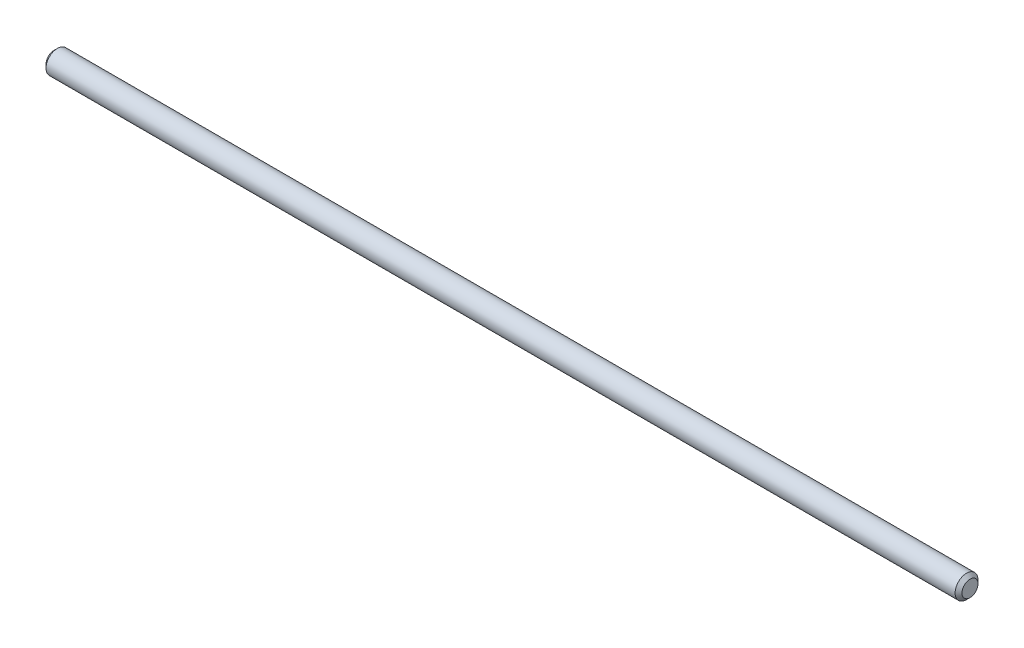
ISO-10303-21;
HEADER;
FILE_DESCRIPTION(('STEP AP214'),'2;1');
FILE_NAME('part.step','',(''),(''),'','','');
FILE_SCHEMA(('AUTOMOTIVE_DESIGN { 1 0 10303 214 1 1 1 1 }'));
ENDSEC;
DATA;
#1=APPLICATION_CONTEXT('core data for automotive mechanical design processes');
#2=APPLICATION_PROTOCOL_DEFINITION('international standard','automotive_design',2000,#1);
#3=PRODUCT_CONTEXT('',#1,'mechanical');
#4=PRODUCT('Part','Part','',(#3));
#5=PRODUCT_RELATED_PRODUCT_CATEGORY('part','',(#4));
#6=PRODUCT_DEFINITION_FORMATION('','',#4);
#7=PRODUCT_DEFINITION_CONTEXT('part definition',#1,'design');
#8=PRODUCT_DEFINITION('design','',#6,#7);
#9=PRODUCT_DEFINITION_SHAPE('','',#8);
#10=(LENGTH_UNIT() NAMED_UNIT(*) SI_UNIT(.MILLI.,.METRE.));
#11=(NAMED_UNIT(*) PLANE_ANGLE_UNIT() SI_UNIT($,.RADIAN.));
#12=(NAMED_UNIT(*) SI_UNIT($,.STERADIAN.) SOLID_ANGLE_UNIT());
#13=UNCERTAINTY_MEASURE_WITH_UNIT(LENGTH_MEASURE(1.E-05),#10,'distance_accuracy_value','');
#14=(GEOMETRIC_REPRESENTATION_CONTEXT(3) GLOBAL_UNCERTAINTY_ASSIGNED_CONTEXT((#13)) GLOBAL_UNIT_ASSIGNED_CONTEXT((#10,
#11,#12)) REPRESENTATION_CONTEXT('',''));
#15=CARTESIAN_POINT('',(0.,0.,0.));
#16=DIRECTION('',(0.,0.,1.));
#17=DIRECTION('',(1.,0.,0.));
#18=AXIS2_PLACEMENT_3D('',#15,#16,#17);
#19=CARTESIAN_POINT('',(-127.,0.,0.));
#20=DIRECTION('',(1.,0.,0.));
#21=DIRECTION('',(0.,0.,-1.));
#22=AXIS2_PLACEMENT_3D('',#19,#20,#21);
#23=CYLINDRICAL_SURFACE('',#22,3.175);
#24=CARTESIAN_POINT('',(-126.0475,0.,0.));
#25=DIRECTION('',(1.,0.,0.));
#26=DIRECTION('',(0.,0.,-1.));
#27=AXIS2_PLACEMENT_3D('',#24,#25,#26);
#28=CIRCLE('',#27,3.175);
#29=CARTESIAN_POINT('',(-126.0475,0.,-3.175));
#30=VERTEX_POINT('',#29);
#31=EDGE_CURVE('E42',#30,#30,#28,.T.);
#32=ORIENTED_EDGE('',*,*,#31,.T.);
#33=EDGE_LOOP('',(#32));
#34=FACE_BOUND('',#33,.T.);
#35=CARTESIAN_POINT('',(126.0475,0.,0.));
#36=DIRECTION('',(1.,0.,0.));
#37=DIRECTION('',(0.,0.,-1.));
#38=AXIS2_PLACEMENT_3D('',#35,#36,#37);
#39=CIRCLE('',#38,3.175);
#40=CARTESIAN_POINT('',(126.0475,0.,3.17500000000001));
#41=VERTEX_POINT('',#40);
#42=EDGE_CURVE('E46',#41,#41,#39,.F.);
#43=ORIENTED_EDGE('',*,*,#42,.T.);
#44=EDGE_LOOP('',(#43));
#45=FACE_BOUND('',#44,.T.);
#46=ADVANCED_FACE('F31',(#34,#45),#23,.T.);
#47=CARTESIAN_POINT('',(-127.,0.,0.));
#48=DIRECTION('',(1.,0.,0.));
#49=DIRECTION('',(0.,0.,-1.));
#50=AXIS2_PLACEMENT_3D('',#47,#48,#49);
#51=PLANE('',#50);
#52=CARTESIAN_POINT('',(-127.,0.,0.));
#53=DIRECTION('',(1.,0.,0.));
#54=DIRECTION('',(0.,0.,-1.));
#55=AXIS2_PLACEMENT_3D('',#52,#53,#54);
#56=CIRCLE('',#55,2.22250000000004);
#57=CARTESIAN_POINT('',(-127.,0.,-2.22250000000004));
#58=VERTEX_POINT('',#57);
#59=EDGE_CURVE('E38',#58,#58,#56,.F.);
#60=ORIENTED_EDGE('',*,*,#59,.T.);
#61=EDGE_LOOP('',(#60));
#62=FACE_BOUND('',#61,.T.);
#63=ADVANCED_FACE('F62',(#62),#51,.F.);
#64=CARTESIAN_POINT('',(127.,0.,0.));
#65=DIRECTION('',(1.,0.,0.));
#66=DIRECTION('',(0.,0.,-1.));
#67=AXIS2_PLACEMENT_3D('',#64,#65,#66);
#68=PLANE('',#67);
#69=CARTESIAN_POINT('',(127.,0.,0.));
#70=DIRECTION('',(1.,0.,0.));
#71=DIRECTION('',(0.,0.,-1.));
#72=AXIS2_PLACEMENT_3D('',#69,#70,#71);
#73=CIRCLE('',#72,2.22249999999999);
#74=CARTESIAN_POINT('',(127.,0.,2.2225));
#75=VERTEX_POINT('',#74);
#76=EDGE_CURVE('E10',#75,#75,#73,.T.);
#77=ORIENTED_EDGE('',*,*,#76,.T.);
#78=EDGE_LOOP('',(#77));
#79=FACE_BOUND('',#78,.T.);
#80=ADVANCED_FACE('F59',(#79),#68,.T.);
#81=CARTESIAN_POINT('',(-126.0475,0.,0.));
#82=DIRECTION('',(1.,0.,0.));
#83=DIRECTION('',(0.,0.,-1.));
#84=AXIS2_PLACEMENT_3D('',#81,#82,#83);
#85=CONICAL_SURFACE('',#84,3.175,0.785398163397442);
#86=ORIENTED_EDGE('',*,*,#59,.F.);
#87=EDGE_LOOP('',(#86));
#88=FACE_BOUND('',#87,.T.);
#89=ORIENTED_EDGE('',*,*,#31,.F.);
#90=EDGE_LOOP('',(#89));
#91=FACE_BOUND('',#90,.T.);
#92=ADVANCED_FACE('F55',(#88,#91),#85,.T.);
#93=CARTESIAN_POINT('',(127.,0.,0.));
#94=DIRECTION('',(-1.,0.,0.));
#95=DIRECTION('',(0.,0.,1.));
#96=AXIS2_PLACEMENT_3D('',#93,#94,#95);
#97=CONICAL_SURFACE('',#96,2.22249999999999,0.785398163397442);
#98=CARTESIAN_POINT('',(126.0475,0.,3.17500000000001));
#99=CARTESIAN_POINT('',(126.057421875,0.,3.16507812500001));
#100=CARTESIAN_POINT('',(126.06734375,0.,3.15515625000001));
#101=CARTESIAN_POINT('',(126.0871875,0.,3.13531250000001));
#102=CARTESIAN_POINT('',(126.097109375,0.,3.12539062500002));
#103=CARTESIAN_POINT('',(126.116953125,0.,3.10554687500001));
#104=CARTESIAN_POINT('',(126.126875,0.,3.09562500000001));
#105=CARTESIAN_POINT('',(126.14671875,0.,3.07578125000001));
#106=CARTESIAN_POINT('',(126.156640625,0.,3.06585937500001));
#107=CARTESIAN_POINT('',(126.176484375,0.,3.04601562500001));
#108=CARTESIAN_POINT('',(126.18640625,0.,3.03609375000001));
#109=CARTESIAN_POINT('',(126.20625,0.,3.01625000000001));
#110=CARTESIAN_POINT('',(126.216171875,0.,3.00632812500001));
#111=CARTESIAN_POINT('',(126.236015625,0.,2.98648437500001));
#112=CARTESIAN_POINT('',(126.2459375,0.,2.97656250000001));
#113=CARTESIAN_POINT('',(126.26578125,0.,2.95671875000001));
#114=CARTESIAN_POINT('',(126.275703125,0.,2.94679687500001));
#115=CARTESIAN_POINT('',(126.295546875,0.,2.92695312500001));
#116=CARTESIAN_POINT('',(126.30546875,0.,2.91703125000001));
#117=CARTESIAN_POINT('',(126.3253125,0.,2.89718750000001));
#118=CARTESIAN_POINT('',(126.335234375,0.,2.88726562500001));
#119=CARTESIAN_POINT('',(126.355078125,0.,2.86742187500001));
#120=CARTESIAN_POINT('',(126.365,0.,2.85750000000001));
#121=CARTESIAN_POINT('',(126.38484375,0.,2.83765625000001));
#122=CARTESIAN_POINT('',(126.394765625,0.,2.82773437500001));
#123=CARTESIAN_POINT('',(126.414609375,0.,2.80789062500001));
#124=CARTESIAN_POINT('',(126.42453125,0.,2.79796875000001));
#125=CARTESIAN_POINT('',(126.444375,0.,2.77812500000001));
#126=CARTESIAN_POINT('',(126.454296875,0.,2.76820312500001));
#127=CARTESIAN_POINT('',(126.474140625,0.,2.74835937500001));
#128=CARTESIAN_POINT('',(126.4840625,0.,2.73843750000001));
#129=CARTESIAN_POINT('',(126.50390625,0.,2.71859375000001));
#130=CARTESIAN_POINT('',(126.513828125,0.,2.70867187500001));
#131=CARTESIAN_POINT('',(126.533671875,0.,2.688828125));
#132=CARTESIAN_POINT('',(126.54359375,0.,2.67890625000001));
#133=CARTESIAN_POINT('',(126.5634375,0.,2.65906250000001));
#134=CARTESIAN_POINT('',(126.573359375,0.,2.64914062500001));
#135=CARTESIAN_POINT('',(126.593203125,0.,2.62929687500001));
#136=CARTESIAN_POINT('',(126.603125,0.,2.61937500000001));
#137=CARTESIAN_POINT('',(126.62296875,0.,2.59953125));
#138=CARTESIAN_POINT('',(126.632890625,0.,2.58960937500001));
#139=CARTESIAN_POINT('',(126.652734375,0.,2.56976562500001));
#140=CARTESIAN_POINT('',(126.66265625,0.,2.55984375000001));
#141=CARTESIAN_POINT('',(126.6825,0.,2.54000000000001));
#142=CARTESIAN_POINT('',(126.692421875,0.,2.530078125));
#143=CARTESIAN_POINT('',(126.712265625,0.,2.510234375));
#144=CARTESIAN_POINT('',(126.7221875,0.,2.5003125));
#145=CARTESIAN_POINT('',(126.74203125,0.,2.48046875000001));
#146=CARTESIAN_POINT('',(126.751953125,0.,2.47054687500001));
#147=CARTESIAN_POINT('',(126.771796875,0.,2.45070312500001));
#148=CARTESIAN_POINT('',(126.78171875,0.,2.44078125));
#149=CARTESIAN_POINT('',(126.8015625,0.,2.4209375));
#150=CARTESIAN_POINT('',(126.811484375,0.,2.41101562500001));
#151=CARTESIAN_POINT('',(126.831328125,0.,2.39117187500001));
#152=CARTESIAN_POINT('',(126.84125,0.,2.38125));
#153=CARTESIAN_POINT('',(126.86109375,0.,2.36140625));
#154=CARTESIAN_POINT('',(126.871015625,0.,2.351484375));
#155=CARTESIAN_POINT('',(126.890859375,0.,2.331640625));
#156=CARTESIAN_POINT('',(126.90078125,0.,2.32171875000001));
#157=CARTESIAN_POINT('',(126.920625,0.,2.301875));
#158=CARTESIAN_POINT('',(126.930546875,0.,2.291953125));
#159=CARTESIAN_POINT('',(126.950390625,0.,2.272109375));
#160=CARTESIAN_POINT('',(126.9603125,0.,2.2621875));
#161=CARTESIAN_POINT('',(126.98015625,0.,2.24234375));
#162=CARTESIAN_POINT('',(126.990078125,0.,2.23242187500001));
#163=CARTESIAN_POINT('',(127.,0.,2.2225));
#164=B_SPLINE_CURVE_WITH_KNOTS('',3,(#98,#99,#100,#101,#102,#103,#104,#105,#106,#107,#108,#109,
#110,#111,#112,#113,#114,#115,#116,#117,#118,#119,#120,#121,#122,#123,#124,#125,#126,#127,#128,
#129,#130,#131,#132,#133,#134,#135,#136,#137,#138,#139,#140,#141,#142,#143,#144,#145,#146,#147,
#148,#149,#150,#151,#152,#153,#154,#155,#156,#157,#158,#159,#160,#161,#162,#163),.UNSPECIFIED.,
.F.,.F.,(4,2,2,2,2,2,2,2,2,2,2,2,2,2,2,2,2,2,2,2,2,2,2,2,2,2,2,2,2,2,2,2,4),(0.,
0.0420949505675197,0.0841899011350394,0.12628485170254,0.168379802270059,0.210474752837579,
0.252569703405079,0.294664653972599,0.336759604540099,0.378854555107619,0.420949505675139,
0.463044456242639,0.505139406810159,0.547234357377678,0.589329307945179,0.631424258512698,
0.673519209080198,0.715614159647718,0.757709110215238,0.799804060782738,0.841899011350257,
0.883993961917777,0.926088912485277,0.968183863052797,1.01027881362032,1.05237376418782,
1.09446871475534,1.13656366532284,1.17865861589036,1.22075356645788,1.26284851702538,
1.3049434675929,1.34703841816042),.UNSPECIFIED.);
#165=EDGE_CURVE('BSEAM33',#41,#75,#164,.T.);
#166=ORIENTED_EDGE('',*,*,#42,.F.);
#167=ORIENTED_EDGE('',*,*,#76,.F.);
#168=ORIENTED_EDGE('',*,*,#165,.T.);
#169=ORIENTED_EDGE('',*,*,#165,.F.);
#170=EDGE_LOOP('',(#166,#168,#167,#169));
#171=FACE_BOUND('',#170,.T.);
#172=ADVANCED_FACE('F33',(#171),#97,.T.);
#173=CLOSED_SHELL('',(#46,#63,#80,#92,#172));
#174=MANIFOLD_SOLID_BREP('B2',#173);
#175=ADVANCED_BREP_SHAPE_REPRESENTATION('',(#18,#174),#14);
#176=SHAPE_DEFINITION_REPRESENTATION(#9,#175);
ENDSEC;
END-ISO-10303-21;
